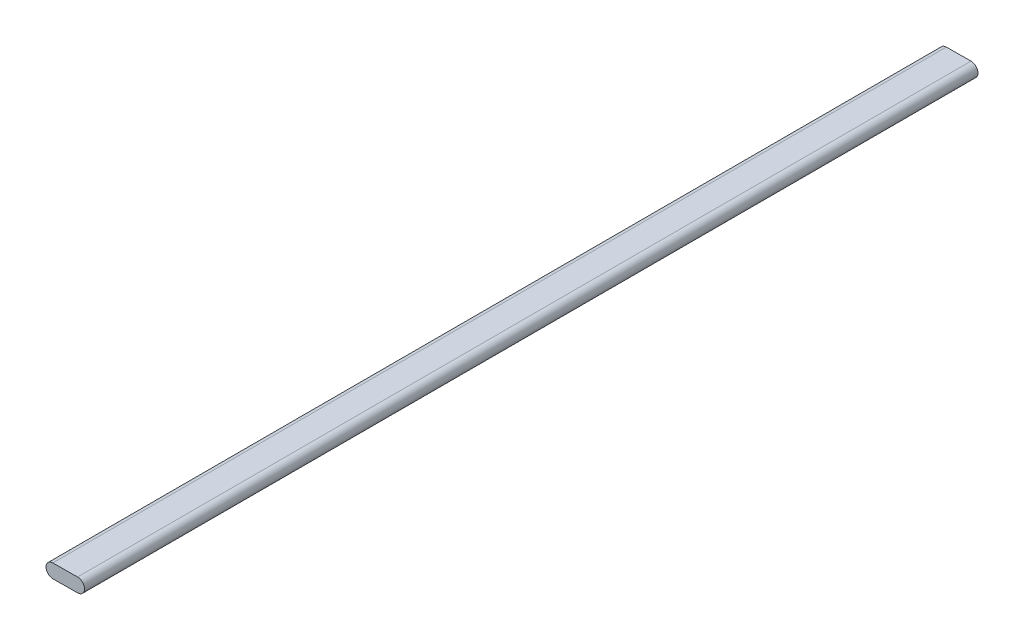
ISO-10303-21;
HEADER;
FILE_DESCRIPTION(('STEP AP214'),'2;1');
FILE_NAME('part.step','',(''),(''),'','','');
FILE_SCHEMA(('AUTOMOTIVE_DESIGN { 1 0 10303 214 1 1 1 1 }'));
ENDSEC;
DATA;
#1=APPLICATION_CONTEXT('core data for automotive mechanical design processes');
#2=APPLICATION_PROTOCOL_DEFINITION('international standard','automotive_design',2000,#1);
#3=PRODUCT_CONTEXT('',#1,'mechanical');
#4=PRODUCT('Part','Part','',(#3));
#5=PRODUCT_RELATED_PRODUCT_CATEGORY('part','',(#4));
#6=PRODUCT_DEFINITION_FORMATION('','',#4);
#7=PRODUCT_DEFINITION_CONTEXT('part definition',#1,'design');
#8=PRODUCT_DEFINITION('design','',#6,#7);
#9=PRODUCT_DEFINITION_SHAPE('','',#8);
#10=(LENGTH_UNIT() NAMED_UNIT(*) SI_UNIT(.MILLI.,.METRE.));
#11=(NAMED_UNIT(*) PLANE_ANGLE_UNIT() SI_UNIT($,.RADIAN.));
#12=(NAMED_UNIT(*) SI_UNIT($,.STERADIAN.) SOLID_ANGLE_UNIT());
#13=UNCERTAINTY_MEASURE_WITH_UNIT(LENGTH_MEASURE(1.E-05),#10,'distance_accuracy_value','');
#14=(GEOMETRIC_REPRESENTATION_CONTEXT(3) GLOBAL_UNCERTAINTY_ASSIGNED_CONTEXT((#13)) GLOBAL_UNIT_ASSIGNED_CONTEXT((#10,
#11,#12)) REPRESENTATION_CONTEXT('',''));
#15=CARTESIAN_POINT('',(0.,0.,0.));
#16=DIRECTION('',(0.,0.,1.));
#17=DIRECTION('',(1.,0.,0.));
#18=AXIS2_PLACEMENT_3D('',#15,#16,#17);
#19=CARTESIAN_POINT('',(-1.79991264900194,2.72952374154085,130.));
#20=DIRECTION('',(0.,0.,-1.));
#21=DIRECTION('',(-1.,0.,0.));
#22=AXIS2_PLACEMENT_3D('',#19,#20,#21);
#23=CYLINDRICAL_SURFACE('',#22,1.);
#24=CARTESIAN_POINT('',(-1.79991264900194,2.72952374154085,0.));
#25=DIRECTION('',(0.,0.,1.));
#26=DIRECTION('',(1.,0.,0.));
#27=AXIS2_PLACEMENT_3D('',#24,#25,#26);
#28=CIRCLE('',#27,1.);
#29=CARTESIAN_POINT('',(-1.80844442335992,3.72948734529166,0.));
#30=VERTEX_POINT('',#29);
#31=CARTESIAN_POINT('',(-1.79138087464396,1.72956013779004,0.));
#32=VERTEX_POINT('',#31);
#33=EDGE_CURVE('E108',#30,#32,#28,.T.);
#34=ORIENTED_EDGE('',*,*,#33,.T.);
#35=DIRECTION('',(0.,0.,-1.));
#36=VECTOR('',#35,1.);
#37=CARTESIAN_POINT('',(-1.79138087464396,1.72956013779004,130.));
#38=LINE('',#37,#36);
#39=CARTESIAN_POINT('',(-1.79138087464396,1.72956013779004,130.));
#40=VERTEX_POINT('',#39);
#41=EDGE_CURVE('E13',#40,#32,#38,.T.);
#42=ORIENTED_EDGE('',*,*,#41,.F.);
#43=CARTESIAN_POINT('',(-1.79991264900194,2.72952374154085,130.));
#44=DIRECTION('',(0.,0.,1.));
#45=DIRECTION('',(1.,0.,0.));
#46=AXIS2_PLACEMENT_3D('',#43,#44,#45);
#47=CIRCLE('',#46,1.);
#48=CARTESIAN_POINT('',(-1.80844442335992,3.72948734529166,130.));
#49=VERTEX_POINT('',#48);
#50=EDGE_CURVE('E96',#49,#40,#47,.T.);
#51=ORIENTED_EDGE('',*,*,#50,.F.);
#52=DIRECTION('',(0.,0.,-1.));
#53=VECTOR('',#52,1.);
#54=CARTESIAN_POINT('',(-1.80844442335992,3.72948734529166,130.));
#55=LINE('',#54,#53);
#56=EDGE_CURVE('E104',#49,#30,#55,.T.);
#57=ORIENTED_EDGE('',*,*,#56,.T.);
#58=EDGE_LOOP('',(#34,#42,#51,#57));
#59=FACE_BOUND('',#58,.T.);
#60=ADVANCED_FACE('F45',(#59),#23,.T.);
#61=CARTESIAN_POINT('',(-1.79138087464396,1.72956013779004,130.));
#62=DIRECTION('',(-0.00853177435797969,0.999963603750809,0.));
#63=DIRECTION('',(-0.999963603750809,-0.00853177435797969,0.));
#64=AXIS2_PLACEMENT_3D('',#61,#62,#63);
#65=PLANE('',#64);
#66=DIRECTION('',(0.999963603750809,0.00853177435797969,0.));
#67=VECTOR('',#66,1.);
#68=CARTESIAN_POINT('',(-1.79138087464396,1.72956013779004,0.));
#69=LINE('',#68,#67);
#70=CARTESIAN_POINT('',(1.80848809885895,1.76027452547877,0.));
#71=VERTEX_POINT('',#70);
#72=EDGE_CURVE('E100',#32,#71,#69,.T.);
#73=ORIENTED_EDGE('',*,*,#72,.T.);
#74=DIRECTION('',(0.,0.,-1.));
#75=VECTOR('',#74,1.);
#76=CARTESIAN_POINT('',(1.80848809885895,1.76027452547877,130.));
#77=LINE('',#76,#75);
#78=CARTESIAN_POINT('',(1.80848809885895,1.76027452547877,130.));
#79=VERTEX_POINT('',#78);
#80=EDGE_CURVE('E53',#79,#71,#77,.T.);
#81=ORIENTED_EDGE('',*,*,#80,.F.);
#82=DIRECTION('',(0.999963603750809,0.00853177435797969,0.));
#83=VECTOR('',#82,1.);
#84=CARTESIAN_POINT('',(-1.79138087464396,1.72956013779004,130.));
#85=LINE('',#84,#83);
#86=EDGE_CURVE('E91',#40,#79,#85,.T.);
#87=ORIENTED_EDGE('',*,*,#86,.F.);
#88=ORIENTED_EDGE('',*,*,#41,.T.);
#89=EDGE_LOOP('',(#73,#81,#87,#88));
#90=FACE_BOUND('',#89,.T.);
#91=ADVANCED_FACE('F99',(#90),#65,.F.);
#92=CARTESIAN_POINT('',(1.79995632450097,2.76023812922958,130.));
#93=DIRECTION('',(0.,0.,-1.));
#94=DIRECTION('',(-1.,0.,0.));
#95=AXIS2_PLACEMENT_3D('',#92,#93,#94);
#96=CYLINDRICAL_SURFACE('',#95,1.);
#97=CARTESIAN_POINT('',(1.79995632450097,2.76023812922958,0.));
#98=DIRECTION('',(0.,0.,1.));
#99=DIRECTION('',(1.,0.,0.));
#100=AXIS2_PLACEMENT_3D('',#97,#98,#99);
#101=CIRCLE('',#100,1.);
#102=CARTESIAN_POINT('',(1.79142455014299,3.76020173298039,0.));
#103=VERTEX_POINT('',#102);
#104=EDGE_CURVE('E78',#71,#103,#101,.T.);
#105=ORIENTED_EDGE('',*,*,#104,.T.);
#106=DIRECTION('',(0.,0.,-1.));
#107=VECTOR('',#106,1.);
#108=CARTESIAN_POINT('',(1.79142455014299,3.76020173298039,130.));
#109=LINE('',#108,#107);
#110=CARTESIAN_POINT('',(1.79142455014299,3.76020173298039,130.));
#111=VERTEX_POINT('',#110);
#112=EDGE_CURVE('E101',#111,#103,#109,.T.);
#113=ORIENTED_EDGE('',*,*,#112,.F.);
#114=CARTESIAN_POINT('',(1.79995632450097,2.76023812922958,130.));
#115=DIRECTION('',(0.,0.,1.));
#116=DIRECTION('',(1.,0.,0.));
#117=AXIS2_PLACEMENT_3D('',#114,#115,#116);
#118=CIRCLE('',#117,1.);
#119=EDGE_CURVE('E94',#79,#111,#118,.T.);
#120=ORIENTED_EDGE('',*,*,#119,.F.);
#121=ORIENTED_EDGE('',*,*,#80,.T.);
#122=EDGE_LOOP('',(#105,#113,#120,#121));
#123=FACE_BOUND('',#122,.T.);
#124=ADVANCED_FACE('F102',(#123),#96,.T.);
#125=CARTESIAN_POINT('',(-1.80844442335992,3.72948734529166,130.));
#126=DIRECTION('',(0.00853177435797969,-0.999963603750809,0.));
#127=DIRECTION('',(0.999963603750809,0.00853177435797969,0.));
#128=AXIS2_PLACEMENT_3D('',#125,#126,#127);
#129=PLANE('',#128);
#130=DIRECTION('',(-0.999963603750809,-0.00853177435797969,0.));
#131=VECTOR('',#130,1.);
#132=CARTESIAN_POINT('',(-1.80844442335992,3.72948734529166,0.));
#133=LINE('',#132,#131);
#134=EDGE_CURVE('E84',#103,#30,#133,.T.);
#135=ORIENTED_EDGE('',*,*,#134,.T.);
#136=ORIENTED_EDGE('',*,*,#56,.F.);
#137=DIRECTION('',(-0.999963603750809,-0.00853177435797969,0.));
#138=VECTOR('',#137,1.);
#139=CARTESIAN_POINT('',(-1.80844442335992,3.72948734529166,130.));
#140=LINE('',#139,#138);
#141=EDGE_CURVE('E61',#111,#49,#140,.T.);
#142=ORIENTED_EDGE('',*,*,#141,.F.);
#143=ORIENTED_EDGE('',*,*,#112,.T.);
#144=EDGE_LOOP('',(#135,#136,#142,#143));
#145=FACE_BOUND('',#144,.T.);
#146=ADVANCED_FACE('F115',(#145),#129,.F.);
#147=CARTESIAN_POINT('',(-1.79991264900194,2.72952374154085,130.));
#148=DIRECTION('',(0.,0.,1.));
#149=DIRECTION('',(1.,0.,0.));
#150=AXIS2_PLACEMENT_3D('',#147,#148,#149);
#151=PLANE('',#150);
#152=ORIENTED_EDGE('',*,*,#50,.T.);
#153=ORIENTED_EDGE('',*,*,#86,.T.);
#154=ORIENTED_EDGE('',*,*,#119,.T.);
#155=ORIENTED_EDGE('',*,*,#141,.T.);
#156=EDGE_LOOP('',(#152,#153,#154,#155));
#157=FACE_BOUND('',#156,.T.);
#158=ADVANCED_FACE('F92',(#157),#151,.T.);
#159=CARTESIAN_POINT('',(-1.79991264900194,2.72952374154085,0.));
#160=DIRECTION('',(0.,0.,1.));
#161=DIRECTION('',(1.,0.,0.));
#162=AXIS2_PLACEMENT_3D('',#159,#160,#161);
#163=PLANE('',#162);
#164=ORIENTED_EDGE('',*,*,#33,.F.);
#165=ORIENTED_EDGE('',*,*,#134,.F.);
#166=ORIENTED_EDGE('',*,*,#104,.F.);
#167=ORIENTED_EDGE('',*,*,#72,.F.);
#168=EDGE_LOOP('',(#164,#165,#166,#167));
#169=FACE_BOUND('',#168,.T.);
#170=ADVANCED_FACE('F118',(#169),#163,.F.);
#171=CLOSED_SHELL('',(#60,#91,#124,#146,#158,#170));
#172=MANIFOLD_SOLID_BREP('B2',#171);
#173=ADVANCED_BREP_SHAPE_REPRESENTATION('',(#18,#172),#14);
#174=SHAPE_DEFINITION_REPRESENTATION(#9,#173);
ENDSEC;
END-ISO-10303-21;
